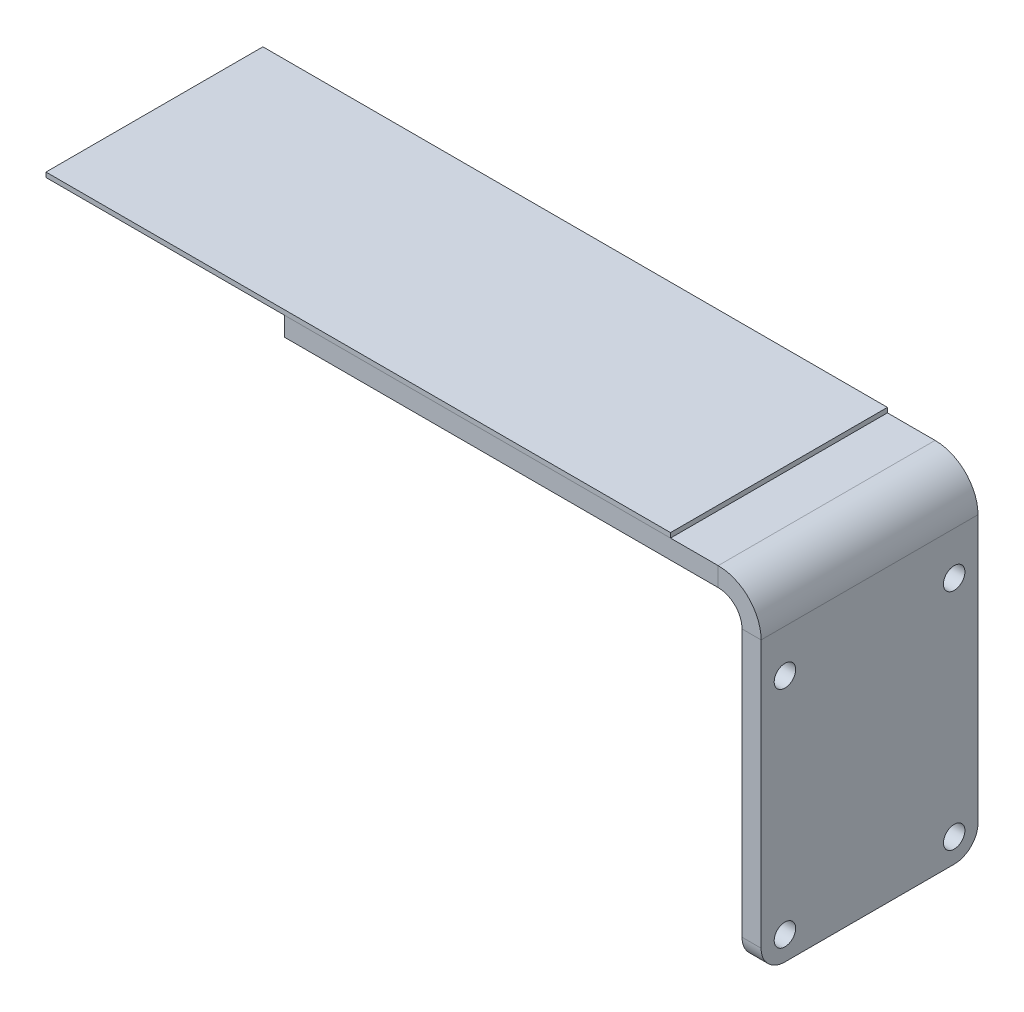
ISO-10303-21;
HEADER;
FILE_DESCRIPTION(('STEP AP214'),'2;1');
FILE_NAME('part.step','',(''),(''),'','','');
FILE_SCHEMA(('AUTOMOTIVE_DESIGN { 1 0 10303 214 1 1 1 1 }'));
ENDSEC;
DATA;
#1=APPLICATION_CONTEXT('core data for automotive mechanical design processes');
#2=APPLICATION_PROTOCOL_DEFINITION('international standard','automotive_design',2000,#1);
#3=PRODUCT_CONTEXT('',#1,'mechanical');
#4=PRODUCT('Part','Part','',(#3));
#5=PRODUCT_RELATED_PRODUCT_CATEGORY('part','',(#4));
#6=PRODUCT_DEFINITION_FORMATION('','',#4);
#7=PRODUCT_DEFINITION_CONTEXT('part definition',#1,'design');
#8=PRODUCT_DEFINITION('design','',#6,#7);
#9=PRODUCT_DEFINITION_SHAPE('','',#8);
#10=(LENGTH_UNIT() NAMED_UNIT(*) SI_UNIT(.MILLI.,.METRE.));
#11=(NAMED_UNIT(*) PLANE_ANGLE_UNIT() SI_UNIT($,.RADIAN.));
#12=(NAMED_UNIT(*) SI_UNIT($,.STERADIAN.) SOLID_ANGLE_UNIT());
#13=UNCERTAINTY_MEASURE_WITH_UNIT(LENGTH_MEASURE(1.E-05),#10,'distance_accuracy_value','');
#14=(GEOMETRIC_REPRESENTATION_CONTEXT(3) GLOBAL_UNCERTAINTY_ASSIGNED_CONTEXT((#13)) GLOBAL_UNIT_ASSIGNED_CONTEXT((#10,
#11,#12)) REPRESENTATION_CONTEXT('',''));
#15=CARTESIAN_POINT('',(0.,0.,0.));
#16=DIRECTION('',(0.,0.,1.));
#17=DIRECTION('',(1.,0.,0.));
#18=AXIS2_PLACEMENT_3D('',#15,#16,#17);
#19=CARTESIAN_POINT('',(-19.,36.,-22.75));
#20=DIRECTION('',(-1.,0.,0.));
#21=DIRECTION('',(0.,-1.,0.));
#22=AXIS2_PLACEMENT_3D('',#19,#20,#21);
#23=PLANE('',#22);
#24=DIRECTION('',(0.,0.,-1.));
#25=VECTOR('',#24,1.);
#26=CARTESIAN_POINT('',(-19.,35.,-22.75));
#27=LINE('',#26,#25);
#28=CARTESIAN_POINT('',(-19.,35.,22.75));
#29=VERTEX_POINT('',#28);
#30=CARTESIAN_POINT('',(-19.,35.,-22.75));
#31=VERTEX_POINT('',#30);
#32=EDGE_CURVE('E133',#29,#31,#27,.T.);
#33=ORIENTED_EDGE('',*,*,#32,.T.);
#34=DIRECTION('',(0.,-1.,0.));
#35=VECTOR('',#34,1.);
#36=CARTESIAN_POINT('',(-19.,36.,-22.75));
#37=LINE('',#36,#35);
#38=CARTESIAN_POINT('',(-19.,36.,-22.75));
#39=VERTEX_POINT('',#38);
#40=EDGE_CURVE('E14',#39,#31,#37,.T.);
#41=ORIENTED_EDGE('',*,*,#40,.F.);
#42=DIRECTION('',(0.,0.,-1.));
#43=VECTOR('',#42,1.);
#44=CARTESIAN_POINT('',(-19.,36.,-22.75));
#45=LINE('',#44,#43);
#46=CARTESIAN_POINT('',(-19.,36.,22.75));
#47=VERTEX_POINT('',#46);
#48=EDGE_CURVE('E121',#47,#39,#45,.T.);
#49=ORIENTED_EDGE('',*,*,#48,.F.);
#50=DIRECTION('',(0.,-1.,0.));
#51=VECTOR('',#50,1.);
#52=CARTESIAN_POINT('',(-19.,36.,22.75));
#53=LINE('',#52,#51);
#54=EDGE_CURVE('E129',#47,#29,#53,.T.);
#55=ORIENTED_EDGE('',*,*,#54,.T.);
#56=EDGE_LOOP('',(#33,#41,#49,#55));
#57=FACE_BOUND('',#56,.T.);
#58=ADVANCED_FACE('F70',(#57),#23,.F.);
#59=CARTESIAN_POINT('',(-19.,36.,-22.75));
#60=DIRECTION('',(0.,0.,1.));
#61=DIRECTION('',(1.,0.,0.));
#62=AXIS2_PLACEMENT_3D('',#59,#60,#61);
#63=PLANE('',#62);
#64=DIRECTION('',(-1.,0.,0.));
#65=VECTOR('',#64,1.);
#66=CARTESIAN_POINT('',(-19.,35.,-22.75));
#67=LINE('',#66,#65);
#68=CARTESIAN_POINT('',(-150.,35.0000000000005,-22.75));
#69=VERTEX_POINT('',#68);
#70=EDGE_CURVE('E125',#31,#69,#67,.T.);
#71=ORIENTED_EDGE('',*,*,#70,.T.);
#72=DIRECTION('',(0.,-1.,0.));
#73=VECTOR('',#72,1.);
#74=CARTESIAN_POINT('',(-150.,36.0000000000005,-22.75));
#75=LINE('',#74,#73);
#76=CARTESIAN_POINT('',(-150.,36.0000000000005,-22.75));
#77=VERTEX_POINT('',#76);
#78=EDGE_CURVE('E78',#77,#69,#75,.T.);
#79=ORIENTED_EDGE('',*,*,#78,.F.);
#80=DIRECTION('',(-1.,0.,0.));
#81=VECTOR('',#80,1.);
#82=CARTESIAN_POINT('',(-19.,36.,-22.75));
#83=LINE('',#82,#81);
#84=EDGE_CURVE('E116',#39,#77,#83,.T.);
#85=ORIENTED_EDGE('',*,*,#84,.F.);
#86=ORIENTED_EDGE('',*,*,#40,.T.);
#87=EDGE_LOOP('',(#71,#79,#85,#86));
#88=FACE_BOUND('',#87,.T.);
#89=ADVANCED_FACE('F124',(#88),#63,.F.);
#90=CARTESIAN_POINT('',(-150.,36.0000000000005,-22.75));
#91=DIRECTION('',(1.,0.,0.));
#92=DIRECTION('',(0.,1.,0.));
#93=AXIS2_PLACEMENT_3D('',#90,#91,#92);
#94=PLANE('',#93);
#95=DIRECTION('',(0.,0.,1.));
#96=VECTOR('',#95,1.);
#97=CARTESIAN_POINT('',(-150.,35.0000000000005,-22.75));
#98=LINE('',#97,#96);
#99=CARTESIAN_POINT('',(-150.,35.0000000000005,22.75));
#100=VERTEX_POINT('',#99);
#101=EDGE_CURVE('E103',#69,#100,#98,.T.);
#102=ORIENTED_EDGE('',*,*,#101,.T.);
#103=DIRECTION('',(0.,-1.,0.));
#104=VECTOR('',#103,1.);
#105=CARTESIAN_POINT('',(-150.,36.0000000000005,22.75));
#106=LINE('',#105,#104);
#107=CARTESIAN_POINT('',(-150.,36.0000000000005,22.75));
#108=VERTEX_POINT('',#107);
#109=EDGE_CURVE('E126',#108,#100,#106,.T.);
#110=ORIENTED_EDGE('',*,*,#109,.F.);
#111=DIRECTION('',(0.,0.,1.));
#112=VECTOR('',#111,1.);
#113=CARTESIAN_POINT('',(-150.,36.0000000000005,-22.75));
#114=LINE('',#113,#112);
#115=EDGE_CURVE('E119',#77,#108,#114,.T.);
#116=ORIENTED_EDGE('',*,*,#115,.F.);
#117=ORIENTED_EDGE('',*,*,#78,.T.);
#118=EDGE_LOOP('',(#102,#110,#116,#117));
#119=FACE_BOUND('',#118,.T.);
#120=ADVANCED_FACE('F127',(#119),#94,.F.);
#121=CARTESIAN_POINT('',(-19.,36.,22.75));
#122=DIRECTION('',(0.,0.,-1.));
#123=DIRECTION('',(-1.,0.,0.));
#124=AXIS2_PLACEMENT_3D('',#121,#122,#123);
#125=PLANE('',#124);
#126=DIRECTION('',(1.,0.,0.));
#127=VECTOR('',#126,1.);
#128=CARTESIAN_POINT('',(-19.,35.,22.75));
#129=LINE('',#128,#127);
#130=EDGE_CURVE('E109',#100,#29,#129,.T.);
#131=ORIENTED_EDGE('',*,*,#130,.T.);
#132=ORIENTED_EDGE('',*,*,#54,.F.);
#133=DIRECTION('',(1.,0.,0.));
#134=VECTOR('',#133,1.);
#135=CARTESIAN_POINT('',(-19.,36.,22.75));
#136=LINE('',#135,#134);
#137=EDGE_CURVE('E86',#108,#47,#136,.T.);
#138=ORIENTED_EDGE('',*,*,#137,.F.);
#139=ORIENTED_EDGE('',*,*,#109,.T.);
#140=EDGE_LOOP('',(#131,#132,#138,#139));
#141=FACE_BOUND('',#140,.T.);
#142=ADVANCED_FACE('F140',(#141),#125,.F.);
#143=CARTESIAN_POINT('',(1.23973138794617E-13,36.,0.));
#144=DIRECTION('',(0.,-1.,0.));
#145=DIRECTION('',(1.,0.,0.));
#146=AXIS2_PLACEMENT_3D('',#143,#144,#145);
#147=PLANE('',#146);
#148=ORIENTED_EDGE('',*,*,#48,.T.);
#149=ORIENTED_EDGE('',*,*,#84,.T.);
#150=ORIENTED_EDGE('',*,*,#115,.T.);
#151=ORIENTED_EDGE('',*,*,#137,.T.);
#152=EDGE_LOOP('',(#148,#149,#150,#151));
#153=FACE_BOUND('',#152,.T.);
#154=ADVANCED_FACE('F117',(#153),#147,.F.);
#155=CARTESIAN_POINT('',(1.20503691842664E-13,35.,0.));
#156=DIRECTION('',(0.,-1.,0.));
#157=DIRECTION('',(1.,0.,0.));
#158=AXIS2_PLACEMENT_3D('',#155,#156,#157);
#159=PLANE('',#158);
#160=ORIENTED_EDGE('',*,*,#32,.F.);
#161=ORIENTED_EDGE('',*,*,#130,.F.);
#162=ORIENTED_EDGE('',*,*,#101,.F.);
#163=ORIENTED_EDGE('',*,*,#70,.F.);
#164=EDGE_LOOP('',(#160,#161,#162,#163));
#165=FACE_BOUND('',#164,.T.);
#166=ADVANCED_FACE('F143',(#165),#159,.T.);
#167=CLOSED_SHELL('',(#58,#89,#120,#142,#154,#166));
#168=MANIFOLD_SOLID_BREP('B2',#167);
#169=CARTESIAN_POINT('',(-4.,-35.,-22.75));
#170=DIRECTION('',(0.,0.,-1.));
#171=DIRECTION('',(-1.,0.,0.));
#172=AXIS2_PLACEMENT_3D('',#169,#170,#171);
#173=PLANE('',#172);
#174=DIRECTION('',(0.,1.,0.));
#175=VECTOR('',#174,1.);
#176=CARTESIAN_POINT('',(0.,-35.,-22.75));
#177=LINE('',#176,#175);
#178=CARTESIAN_POINT('',(0.,-30.,-22.75));
#179=VERTEX_POINT('',#178);
#180=CARTESIAN_POINT('',(0.,26.,-22.75));
#181=VERTEX_POINT('',#180);
#182=EDGE_CURVE('E377',#179,#181,#177,.T.);
#183=ORIENTED_EDGE('',*,*,#182,.F.);
#184=DIRECTION('',(1.,0.,0.));
#185=VECTOR('',#184,1.);
#186=CARTESIAN_POINT('',(-4.,-30.,-22.75));
#187=LINE('',#186,#185);
#188=CARTESIAN_POINT('',(-4.,-30.,-22.75));
#189=VERTEX_POINT('',#188);
#190=EDGE_CURVE('E228',#179,#189,#187,.F.);
#191=ORIENTED_EDGE('',*,*,#190,.T.);
#192=DIRECTION('',(0.,1.,0.));
#193=VECTOR('',#192,1.);
#194=CARTESIAN_POINT('',(-4.,-35.,-22.75));
#195=LINE('',#194,#193);
#196=CARTESIAN_POINT('',(-4.,26.,-22.75));
#197=VERTEX_POINT('',#196);
#198=EDGE_CURVE('E380',#189,#197,#195,.T.);
#199=ORIENTED_EDGE('',*,*,#198,.T.);
#200=DIRECTION('',(1.,0.,0.));
#201=VECTOR('',#200,1.);
#202=CARTESIAN_POINT('',(-4.,26.,-22.75));
#203=LINE('',#202,#201);
#204=EDGE_CURVE('E342',#197,#181,#203,.T.);
#205=ORIENTED_EDGE('',*,*,#204,.T.);
#206=EDGE_LOOP('',(#183,#191,#199,#205));
#207=FACE_BOUND('',#206,.T.);
#208=ADVANCED_FACE('F205',(#207),#173,.T.);
#209=CARTESIAN_POINT('',(-4.,0.,0.));
#210=DIRECTION('',(-1.,0.,0.));
#211=DIRECTION('',(0.,0.,1.));
#212=AXIS2_PLACEMENT_3D('',#209,#210,#211);
#213=PLANE('',#212);
#214=CARTESIAN_POINT('',(-4.,17.,17.75));
#215=DIRECTION('',(1.,0.,0.));
#216=DIRECTION('',(0.,0.,-1.));
#217=AXIS2_PLACEMENT_3D('',#214,#215,#216);
#218=CIRCLE('',#217,2.25);
#219=CARTESIAN_POINT('',(-4.,17.,15.5));
#220=VERTEX_POINT('',#219);
#221=EDGE_CURVE('E356',#220,#220,#218,.T.);
#222=ORIENTED_EDGE('',*,*,#221,.T.);
#223=EDGE_LOOP('',(#222));
#224=FACE_BOUND('',#223,.T.);
#225=CARTESIAN_POINT('',(-4.,17.,-17.75));
#226=DIRECTION('',(1.,0.,0.));
#227=DIRECTION('',(0.,0.,-1.));
#228=AXIS2_PLACEMENT_3D('',#225,#226,#227);
#229=CIRCLE('',#228,2.25);
#230=CARTESIAN_POINT('',(-4.,17.,-20.));
#231=VERTEX_POINT('',#230);
#232=EDGE_CURVE('E362',#231,#231,#229,.T.);
#233=ORIENTED_EDGE('',*,*,#232,.T.);
#234=EDGE_LOOP('',(#233));
#235=FACE_BOUND('',#234,.T.);
#236=CARTESIAN_POINT('',(-4.,-30.,-17.75));
#237=DIRECTION('',(1.,0.,0.));
#238=DIRECTION('',(0.,0.,-1.));
#239=AXIS2_PLACEMENT_3D('',#236,#237,#238);
#240=CIRCLE('',#239,2.25);
#241=CARTESIAN_POINT('',(-4.,-30.,-20.));
#242=VERTEX_POINT('',#241);
#243=EDGE_CURVE('E368',#242,#242,#240,.T.);
#244=ORIENTED_EDGE('',*,*,#243,.T.);
#245=EDGE_LOOP('',(#244));
#246=FACE_BOUND('',#245,.T.);
#247=CARTESIAN_POINT('',(-4.,-30.,17.75));
#248=DIRECTION('',(1.,0.,0.));
#249=DIRECTION('',(0.,0.,-1.));
#250=AXIS2_PLACEMENT_3D('',#247,#248,#249);
#251=CIRCLE('',#250,2.25);
#252=CARTESIAN_POINT('',(-4.,-30.,15.5));
#253=VERTEX_POINT('',#252);
#254=EDGE_CURVE('E374',#253,#253,#251,.T.);
#255=ORIENTED_EDGE('',*,*,#254,.T.);
#256=EDGE_LOOP('',(#255));
#257=FACE_BOUND('',#256,.T.);
#258=ORIENTED_EDGE('',*,*,#198,.F.);
#259=CARTESIAN_POINT('',(-4.,-30.,-17.75));
#260=DIRECTION('',(-1.,0.,0.));
#261=DIRECTION('',(0.,0.,1.));
#262=AXIS2_PLACEMENT_3D('',#259,#260,#261);
#263=CIRCLE('',#262,5.);
#264=CARTESIAN_POINT('',(-4.,-35.,-17.75));
#265=VERTEX_POINT('',#264);
#266=EDGE_CURVE('E213',#189,#265,#263,.T.);
#267=ORIENTED_EDGE('',*,*,#266,.T.);
#268=DIRECTION('',(0.,0.,-1.));
#269=VECTOR('',#268,1.);
#270=CARTESIAN_POINT('',(-4.,-35.,22.75));
#271=LINE('',#270,#269);
#272=CARTESIAN_POINT('',(-4.,-35.,17.75));
#273=VERTEX_POINT('',#272);
#274=EDGE_CURVE('E385',#273,#265,#271,.T.);
#275=ORIENTED_EDGE('',*,*,#274,.F.);
#276=CARTESIAN_POINT('',(-4.,-30.,17.75));
#277=DIRECTION('',(-1.,0.,0.));
#278=DIRECTION('',(0.,0.,1.));
#279=AXIS2_PLACEMENT_3D('',#276,#277,#278);
#280=CIRCLE('',#279,5.);
#281=CARTESIAN_POINT('',(-4.,-30.,22.75));
#282=VERTEX_POINT('',#281);
#283=EDGE_CURVE('E220',#273,#282,#280,.T.);
#284=ORIENTED_EDGE('',*,*,#283,.T.);
#285=DIRECTION('',(0.,-1.,0.));
#286=VECTOR('',#285,1.);
#287=CARTESIAN_POINT('',(-4.,-35.,22.75));
#288=LINE('',#287,#286);
#289=CARTESIAN_POINT('',(-4.,26.,22.75));
#290=VERTEX_POINT('',#289);
#291=EDGE_CURVE('E382',#290,#282,#288,.T.);
#292=ORIENTED_EDGE('',*,*,#291,.F.);
#293=DIRECTION('',(0.,0.,-1.));
#294=VECTOR('',#293,1.);
#295=CARTESIAN_POINT('',(-4.,26.,-22.75));
#296=LINE('',#295,#294);
#297=EDGE_CURVE('E346',#197,#290,#296,.F.);
#298=ORIENTED_EDGE('',*,*,#297,.F.);
#299=EDGE_LOOP('',(#258,#267,#275,#284,#292,#298));
#300=FACE_BOUND('',#299,.T.);
#301=ADVANCED_FACE('F405',(#224,#235,#246,#257,#300),#213,.T.);
#302=CARTESIAN_POINT('',(0.,0.,0.));
#303=DIRECTION('',(-1.,0.,0.));
#304=DIRECTION('',(0.,0.,1.));
#305=AXIS2_PLACEMENT_3D('',#302,#303,#304);
#306=PLANE('',#305);
#307=CARTESIAN_POINT('',(0.,-30.,17.75));
#308=DIRECTION('',(1.,0.,0.));
#309=DIRECTION('',(0.,0.,-1.));
#310=AXIS2_PLACEMENT_3D('',#307,#308,#309);
#311=CIRCLE('',#310,2.25);
#312=CARTESIAN_POINT('',(0.,-30.,15.5));
#313=VERTEX_POINT('',#312);
#314=EDGE_CURVE('E371',#313,#313,#311,.T.);
#315=ORIENTED_EDGE('',*,*,#314,.F.);
#316=EDGE_LOOP('',(#315));
#317=FACE_BOUND('',#316,.T.);
#318=CARTESIAN_POINT('',(0.,-30.,-17.75));
#319=DIRECTION('',(1.,0.,0.));
#320=DIRECTION('',(0.,0.,-1.));
#321=AXIS2_PLACEMENT_3D('',#318,#319,#320);
#322=CIRCLE('',#321,2.25);
#323=CARTESIAN_POINT('',(0.,-30.,-20.));
#324=VERTEX_POINT('',#323);
#325=EDGE_CURVE('E365',#324,#324,#322,.T.);
#326=ORIENTED_EDGE('',*,*,#325,.F.);
#327=EDGE_LOOP('',(#326));
#328=FACE_BOUND('',#327,.T.);
#329=CARTESIAN_POINT('',(0.,17.,-17.75));
#330=DIRECTION('',(1.,0.,0.));
#331=DIRECTION('',(0.,0.,-1.));
#332=AXIS2_PLACEMENT_3D('',#329,#330,#331);
#333=CIRCLE('',#332,2.25);
#334=CARTESIAN_POINT('',(0.,17.,-20.));
#335=VERTEX_POINT('',#334);
#336=EDGE_CURVE('E359',#335,#335,#333,.T.);
#337=ORIENTED_EDGE('',*,*,#336,.F.);
#338=EDGE_LOOP('',(#337));
#339=FACE_BOUND('',#338,.T.);
#340=CARTESIAN_POINT('',(0.,17.,17.75));
#341=DIRECTION('',(1.,0.,0.));
#342=DIRECTION('',(0.,0.,-1.));
#343=AXIS2_PLACEMENT_3D('',#340,#341,#342);
#344=CIRCLE('',#343,2.25);
#345=CARTESIAN_POINT('',(0.,17.,15.5));
#346=VERTEX_POINT('',#345);
#347=EDGE_CURVE('E353',#346,#346,#344,.T.);
#348=ORIENTED_EDGE('',*,*,#347,.F.);
#349=EDGE_LOOP('',(#348));
#350=FACE_BOUND('',#349,.T.);
#351=DIRECTION('',(0.,0.,-1.));
#352=VECTOR('',#351,1.);
#353=CARTESIAN_POINT('',(0.,-35.,22.75));
#354=LINE('',#353,#352);
#355=CARTESIAN_POINT('',(0.,-35.,17.75));
#356=VERTEX_POINT('',#355);
#357=CARTESIAN_POINT('',(0.,-35.,-17.75));
#358=VERTEX_POINT('',#357);
#359=EDGE_CURVE('E383',#356,#358,#354,.T.);
#360=ORIENTED_EDGE('',*,*,#359,.T.);
#361=CARTESIAN_POINT('',(0.,-30.,-17.75));
#362=DIRECTION('',(-1.,0.,0.));
#363=DIRECTION('',(0.,0.,1.));
#364=AXIS2_PLACEMENT_3D('',#361,#362,#363);
#365=CIRCLE('',#364,5.);
#366=EDGE_CURVE('E401',#358,#179,#365,.F.);
#367=ORIENTED_EDGE('',*,*,#366,.T.);
#368=ORIENTED_EDGE('',*,*,#182,.T.);
#369=DIRECTION('',(0.,0.,-1.));
#370=VECTOR('',#369,1.);
#371=CARTESIAN_POINT('',(0.,26.,-22.75));
#372=LINE('',#371,#370);
#373=CARTESIAN_POINT('',(0.,26.,22.75));
#374=VERTEX_POINT('',#373);
#375=EDGE_CURVE('E292',#181,#374,#372,.F.);
#376=ORIENTED_EDGE('',*,*,#375,.T.);
#377=DIRECTION('',(0.,-1.,0.));
#378=VECTOR('',#377,1.);
#379=CARTESIAN_POINT('',(0.,-35.,22.75));
#380=LINE('',#379,#378);
#381=CARTESIAN_POINT('',(0.,-30.,22.75));
#382=VERTEX_POINT('',#381);
#383=EDGE_CURVE('E390',#374,#382,#380,.T.);
#384=ORIENTED_EDGE('',*,*,#383,.T.);
#385=CARTESIAN_POINT('',(0.,-30.,17.75));
#386=DIRECTION('',(-1.,0.,0.));
#387=DIRECTION('',(0.,0.,1.));
#388=AXIS2_PLACEMENT_3D('',#385,#386,#387);
#389=CIRCLE('',#388,5.);
#390=EDGE_CURVE('E399',#382,#356,#389,.F.);
#391=ORIENTED_EDGE('',*,*,#390,.T.);
#392=EDGE_LOOP('',(#360,#367,#368,#376,#384,#391));
#393=FACE_BOUND('',#392,.T.);
#394=ADVANCED_FACE('F415',(#317,#328,#339,#350,#393),#306,.F.);
#395=CARTESIAN_POINT('',(-4.,-35.,22.75));
#396=DIRECTION('',(0.,-1.,0.));
#397=DIRECTION('',(0.,0.,-1.));
#398=AXIS2_PLACEMENT_3D('',#395,#396,#397);
#399=PLANE('',#398);
#400=ORIENTED_EDGE('',*,*,#274,.T.);
#401=DIRECTION('',(1.,0.,0.));
#402=VECTOR('',#401,1.);
#403=CARTESIAN_POINT('',(-4.,-35.,-17.75));
#404=LINE('',#403,#402);
#405=EDGE_CURVE('E396',#265,#358,#404,.T.);
#406=ORIENTED_EDGE('',*,*,#405,.T.);
#407=ORIENTED_EDGE('',*,*,#359,.F.);
#408=DIRECTION('',(1.,0.,0.));
#409=VECTOR('',#408,1.);
#410=CARTESIAN_POINT('',(-4.,-35.,17.75));
#411=LINE('',#410,#409);
#412=EDGE_CURVE('E388',#356,#273,#411,.F.);
#413=ORIENTED_EDGE('',*,*,#412,.T.);
#414=EDGE_LOOP('',(#400,#406,#407,#413));
#415=FACE_BOUND('',#414,.T.);
#416=ADVANCED_FACE('F410',(#415),#399,.T.);
#417=CARTESIAN_POINT('',(-4.,-35.,22.75));
#418=DIRECTION('',(0.,0.,1.));
#419=DIRECTION('',(1.,0.,0.));
#420=AXIS2_PLACEMENT_3D('',#417,#418,#419);
#421=PLANE('',#420);
#422=ORIENTED_EDGE('',*,*,#291,.T.);
#423=DIRECTION('',(1.,0.,0.));
#424=VECTOR('',#423,1.);
#425=CARTESIAN_POINT('',(-4.,-30.,22.75));
#426=LINE('',#425,#424);
#427=EDGE_CURVE('E68',#282,#382,#426,.T.);
#428=ORIENTED_EDGE('',*,*,#427,.T.);
#429=ORIENTED_EDGE('',*,*,#383,.F.);
#430=DIRECTION('',(1.,0.,0.));
#431=VECTOR('',#430,1.);
#432=CARTESIAN_POINT('',(-4.,26.,22.75));
#433=LINE('',#432,#431);
#434=EDGE_CURVE('E350',#290,#374,#433,.T.);
#435=ORIENTED_EDGE('',*,*,#434,.F.);
#436=EDGE_LOOP('',(#422,#428,#429,#435));
#437=FACE_BOUND('',#436,.T.);
#438=ADVANCED_FACE('F446',(#437),#421,.T.);
#439=CARTESIAN_POINT('',(-4.,-30.,17.75));
#440=DIRECTION('',(1.,0.,0.));
#441=DIRECTION('',(0.,0.,-1.));
#442=AXIS2_PLACEMENT_3D('',#439,#440,#441);
#443=CYLINDRICAL_SURFACE('',#442,2.25);
#444=ORIENTED_EDGE('',*,*,#254,.F.);
#445=EDGE_LOOP('',(#444));
#446=FACE_BOUND('',#445,.T.);
#447=ORIENTED_EDGE('',*,*,#314,.T.);
#448=EDGE_LOOP('',(#447));
#449=FACE_BOUND('',#448,.T.);
#450=ADVANCED_FACE('F449',(#446,#449),#443,.F.);
#451=CARTESIAN_POINT('',(-4.,-30.,-17.75));
#452=DIRECTION('',(1.,0.,0.));
#453=DIRECTION('',(0.,0.,-1.));
#454=AXIS2_PLACEMENT_3D('',#451,#452,#453);
#455=CYLINDRICAL_SURFACE('',#454,2.25);
#456=ORIENTED_EDGE('',*,*,#243,.F.);
#457=EDGE_LOOP('',(#456));
#458=FACE_BOUND('',#457,.T.);
#459=ORIENTED_EDGE('',*,*,#325,.T.);
#460=EDGE_LOOP('',(#459));
#461=FACE_BOUND('',#460,.T.);
#462=ADVANCED_FACE('F458',(#458,#461),#455,.F.);
#463=CARTESIAN_POINT('',(-4.,17.,-17.75));
#464=DIRECTION('',(1.,0.,0.));
#465=DIRECTION('',(0.,0.,-1.));
#466=AXIS2_PLACEMENT_3D('',#463,#464,#465);
#467=CYLINDRICAL_SURFACE('',#466,2.25);
#468=ORIENTED_EDGE('',*,*,#232,.F.);
#469=EDGE_LOOP('',(#468));
#470=FACE_BOUND('',#469,.T.);
#471=ORIENTED_EDGE('',*,*,#336,.T.);
#472=EDGE_LOOP('',(#471));
#473=FACE_BOUND('',#472,.T.);
#474=ADVANCED_FACE('F462',(#470,#473),#467,.F.);
#475=CARTESIAN_POINT('',(-4.,17.,17.75));
#476=DIRECTION('',(1.,0.,0.));
#477=DIRECTION('',(0.,0.,-1.));
#478=AXIS2_PLACEMENT_3D('',#475,#476,#477);
#479=CYLINDRICAL_SURFACE('',#478,2.25);
#480=ORIENTED_EDGE('',*,*,#221,.F.);
#481=EDGE_LOOP('',(#480));
#482=FACE_BOUND('',#481,.T.);
#483=ORIENTED_EDGE('',*,*,#347,.T.);
#484=EDGE_LOOP('',(#483));
#485=FACE_BOUND('',#484,.T.);
#486=ADVANCED_FACE('F466',(#482,#485),#479,.F.);
#487=CARTESIAN_POINT('',(-9.,26.,22.75));
#488=DIRECTION('',(0.,0.,1.));
#489=DIRECTION('',(1.,0.,0.));
#490=AXIS2_PLACEMENT_3D('',#487,#488,#489);
#491=PLANE('',#490);
#492=DIRECTION('',(0.,1.,0.));
#493=VECTOR('',#492,1.);
#494=CARTESIAN_POINT('',(-8.99999999999997,35.,22.75));
#495=LINE('',#494,#493);
#496=CARTESIAN_POINT('',(-8.99999999999998,31.,22.75));
#497=VERTEX_POINT('',#496);
#498=CARTESIAN_POINT('',(-8.99999999999997,35.,22.75));
#499=VERTEX_POINT('',#498);
#500=EDGE_CURVE('E337',#497,#499,#495,.T.);
#501=ORIENTED_EDGE('',*,*,#500,.F.);
#502=CARTESIAN_POINT('',(-9.,26.,22.75));
#503=DIRECTION('',(0.,0.,-1.));
#504=DIRECTION('',(-1.,0.,0.));
#505=AXIS2_PLACEMENT_3D('',#502,#503,#504);
#506=CIRCLE('',#505,5.);
#507=EDGE_CURVE('E295',#290,#497,#506,.F.);
#508=ORIENTED_EDGE('',*,*,#507,.F.);
#509=ORIENTED_EDGE('',*,*,#434,.T.);
#510=CARTESIAN_POINT('',(-9.,26.,22.75));
#511=DIRECTION('',(0.,0.,-1.));
#512=DIRECTION('',(-1.,0.,0.));
#513=AXIS2_PLACEMENT_3D('',#510,#511,#512);
#514=CIRCLE('',#513,9.);
#515=EDGE_CURVE('E341',#374,#499,#514,.F.);
#516=ORIENTED_EDGE('',*,*,#515,.T.);
#517=EDGE_LOOP('',(#501,#508,#509,#516));
#518=FACE_BOUND('',#517,.T.);
#519=ADVANCED_FACE('F470',(#518),#491,.T.);
#520=CARTESIAN_POINT('',(-9.,26.,-22.75));
#521=DIRECTION('',(0.,0.,1.));
#522=DIRECTION('',(1.,0.,0.));
#523=AXIS2_PLACEMENT_3D('',#520,#521,#522);
#524=PLANE('',#523);
#525=CARTESIAN_POINT('',(-9.,26.,-22.75));
#526=DIRECTION('',(0.,0.,-1.));
#527=DIRECTION('',(-1.,0.,0.));
#528=AXIS2_PLACEMENT_3D('',#525,#526,#527);
#529=CIRCLE('',#528,5.);
#530=CARTESIAN_POINT('',(-8.99999999999998,31.,-22.75));
#531=VERTEX_POINT('',#530);
#532=EDGE_CURVE('E302',#531,#197,#529,.T.);
#533=ORIENTED_EDGE('',*,*,#532,.F.);
#534=DIRECTION('',(0.,1.,0.));
#535=VECTOR('',#534,1.);
#536=CARTESIAN_POINT('',(-8.99999999999998,31.,-22.75));
#537=LINE('',#536,#535);
#538=CARTESIAN_POINT('',(-8.99999999999997,35.,-22.75));
#539=VERTEX_POINT('',#538);
#540=EDGE_CURVE('E299',#531,#539,#537,.T.);
#541=ORIENTED_EDGE('',*,*,#540,.T.);
#542=CARTESIAN_POINT('',(-9.,26.,-22.75));
#543=DIRECTION('',(0.,0.,-1.));
#544=DIRECTION('',(-1.,0.,0.));
#545=AXIS2_PLACEMENT_3D('',#542,#543,#544);
#546=CIRCLE('',#545,9.);
#547=EDGE_CURVE('E285',#539,#181,#546,.T.);
#548=ORIENTED_EDGE('',*,*,#547,.T.);
#549=ORIENTED_EDGE('',*,*,#204,.F.);
#550=EDGE_LOOP('',(#533,#541,#548,#549));
#551=FACE_BOUND('',#550,.T.);
#552=ADVANCED_FACE('F300',(#551),#524,.F.);
#553=CARTESIAN_POINT('',(-9.,26.,-22.75));
#554=DIRECTION('',(0.,0.,-1.));
#555=DIRECTION('',(0.,1.,0.));
#556=AXIS2_PLACEMENT_3D('',#553,#554,#555);
#557=CYLINDRICAL_SURFACE('',#556,9.);
#558=ORIENTED_EDGE('',*,*,#375,.F.);
#559=ORIENTED_EDGE('',*,*,#547,.F.);
#560=DIRECTION('',(0.,0.,-1.));
#561=VECTOR('',#560,1.);
#562=CARTESIAN_POINT('',(-8.99999999999997,35.,0.));
#563=LINE('',#562,#561);
#564=EDGE_CURVE('E290',#499,#539,#563,.T.);
#565=ORIENTED_EDGE('',*,*,#564,.F.);
#566=ORIENTED_EDGE('',*,*,#515,.F.);
#567=EDGE_LOOP('',(#558,#559,#565,#566));
#568=FACE_BOUND('',#567,.T.);
#569=ADVANCED_FACE('F287',(#568),#557,.T.);
#570=CARTESIAN_POINT('',(-9.,26.,-22.75));
#571=DIRECTION('',(0.,0.,-1.));
#572=DIRECTION('',(0.,1.,0.));
#573=AXIS2_PLACEMENT_3D('',#570,#571,#572);
#574=CYLINDRICAL_SURFACE('',#573,5.);
#575=ORIENTED_EDGE('',*,*,#297,.T.);
#576=ORIENTED_EDGE('',*,*,#507,.T.);
#577=DIRECTION('',(0.,0.,1.));
#578=VECTOR('',#577,1.);
#579=CARTESIAN_POINT('',(-8.99999999999998,31.,22.75));
#580=LINE('',#579,#578);
#581=EDGE_CURVE('E307',#497,#531,#580,.F.);
#582=ORIENTED_EDGE('',*,*,#581,.T.);
#583=ORIENTED_EDGE('',*,*,#532,.T.);
#584=EDGE_LOOP('',(#575,#576,#582,#583));
#585=FACE_BOUND('',#584,.T.);
#586=ADVANCED_FACE('F417',(#585),#574,.F.);
#587=CARTESIAN_POINT('',(-3.99999999999999,35.,-22.75));
#588=DIRECTION('',(0.,0.,-1.));
#589=DIRECTION('',(-1.,0.,0.));
#590=AXIS2_PLACEMENT_3D('',#587,#588,#589);
#591=PLANE('',#590);
#592=DIRECTION('',(1.,0.,0.));
#593=VECTOR('',#592,1.);
#594=CARTESIAN_POINT('',(-3.99999999999999,35.,-22.75));
#595=LINE('',#594,#593);
#596=CARTESIAN_POINT('',(-100.,35.0000000000003,-22.75));
#597=VERTEX_POINT('',#596);
#598=EDGE_CURVE('E314',#597,#539,#595,.T.);
#599=ORIENTED_EDGE('',*,*,#598,.T.);
#600=ORIENTED_EDGE('',*,*,#540,.F.);
#601=DIRECTION('',(-1.,0.,0.));
#602=VECTOR('',#601,1.);
#603=CARTESIAN_POINT('',(1.21430643318376E-13,31.,-22.75));
#604=LINE('',#603,#602);
#605=CARTESIAN_POINT('',(-100.,31.0000000000003,-22.75));
#606=VERTEX_POINT('',#605);
#607=EDGE_CURVE('E330',#606,#531,#604,.F.);
#608=ORIENTED_EDGE('',*,*,#607,.F.);
#609=DIRECTION('',(0.,-1.,0.));
#610=VECTOR('',#609,1.);
#611=CARTESIAN_POINT('',(-100.,35.0000000000003,-22.75));
#612=LINE('',#611,#610);
#613=EDGE_CURVE('E319',#597,#606,#612,.T.);
#614=ORIENTED_EDGE('',*,*,#613,.F.);
#615=EDGE_LOOP('',(#599,#600,#608,#614));
#616=FACE_BOUND('',#615,.T.);
#617=ADVANCED_FACE('F318',(#616),#591,.T.);
#618=CARTESIAN_POINT('',(-100.,35.0000000000003,22.75));
#619=DIRECTION('',(0.,0.,1.));
#620=DIRECTION('',(1.,0.,0.));
#621=AXIS2_PLACEMENT_3D('',#618,#619,#620);
#622=PLANE('',#621);
#623=DIRECTION('',(1.,0.,0.));
#624=VECTOR('',#623,1.);
#625=CARTESIAN_POINT('',(1.21430643318376E-13,31.,22.75));
#626=LINE('',#625,#624);
#627=CARTESIAN_POINT('',(-100.,31.0000000000003,22.75));
#628=VERTEX_POINT('',#627);
#629=EDGE_CURVE('E316',#497,#628,#626,.F.);
#630=ORIENTED_EDGE('',*,*,#629,.F.);
#631=ORIENTED_EDGE('',*,*,#500,.T.);
#632=DIRECTION('',(-1.,0.,0.));
#633=VECTOR('',#632,1.);
#634=CARTESIAN_POINT('',(-100.,35.0000000000003,22.75));
#635=LINE('',#634,#633);
#636=CARTESIAN_POINT('',(-100.,35.0000000000003,22.75));
#637=VERTEX_POINT('',#636);
#638=EDGE_CURVE('E315',#499,#637,#635,.T.);
#639=ORIENTED_EDGE('',*,*,#638,.T.);
#640=DIRECTION('',(0.,-1.,0.));
#641=VECTOR('',#640,1.);
#642=CARTESIAN_POINT('',(-100.,35.0000000000003,22.75));
#643=LINE('',#642,#641);
#644=EDGE_CURVE('E321',#637,#628,#643,.T.);
#645=ORIENTED_EDGE('',*,*,#644,.T.);
#646=EDGE_LOOP('',(#630,#631,#639,#645));
#647=FACE_BOUND('',#646,.T.);
#648=ADVANCED_FACE('F424',(#647),#622,.T.);
#649=CARTESIAN_POINT('',(1.35396568673749E-13,35.,0.));
#650=DIRECTION('',(0.,1.,0.));
#651=DIRECTION('',(-1.,0.,0.));
#652=AXIS2_PLACEMENT_3D('',#649,#650,#651);
#653=PLANE('',#652);
#654=ORIENTED_EDGE('',*,*,#638,.F.);
#655=ORIENTED_EDGE('',*,*,#564,.T.);
#656=ORIENTED_EDGE('',*,*,#598,.F.);
#657=DIRECTION('',(0.,0.,-1.));
#658=VECTOR('',#657,1.);
#659=CARTESIAN_POINT('',(-100.,35.0000000000003,-22.75));
#660=LINE('',#659,#658);
#661=EDGE_CURVE('E322',#637,#597,#660,.T.);
#662=ORIENTED_EDGE('',*,*,#661,.F.);
#663=EDGE_LOOP('',(#654,#655,#656,#662));
#664=FACE_BOUND('',#663,.T.);
#665=ADVANCED_FACE('F312',(#664),#653,.T.);
#666=CARTESIAN_POINT('',(1.21430643318376E-13,31.,0.));
#667=DIRECTION('',(0.,1.,0.));
#668=DIRECTION('',(-1.,0.,0.));
#669=AXIS2_PLACEMENT_3D('',#666,#667,#668);
#670=PLANE('',#669);
#671=ORIENTED_EDGE('',*,*,#581,.F.);
#672=ORIENTED_EDGE('',*,*,#629,.T.);
#673=DIRECTION('',(0.,0.,1.));
#674=VECTOR('',#673,1.);
#675=CARTESIAN_POINT('',(-100.,31.0000000000003,0.));
#676=LINE('',#675,#674);
#677=EDGE_CURVE('E332',#628,#606,#676,.F.);
#678=ORIENTED_EDGE('',*,*,#677,.T.);
#679=ORIENTED_EDGE('',*,*,#607,.T.);
#680=EDGE_LOOP('',(#671,#672,#678,#679));
#681=FACE_BOUND('',#680,.T.);
#682=ADVANCED_FACE('F422',(#681),#670,.F.);
#683=CARTESIAN_POINT('',(-100.,35.0000000000003,-22.75));
#684=DIRECTION('',(-1.,0.,0.));
#685=DIRECTION('',(0.,-1.,0.));
#686=AXIS2_PLACEMENT_3D('',#683,#684,#685);
#687=PLANE('',#686);
#688=ORIENTED_EDGE('',*,*,#677,.F.);
#689=ORIENTED_EDGE('',*,*,#644,.F.);
#690=ORIENTED_EDGE('',*,*,#661,.T.);
#691=ORIENTED_EDGE('',*,*,#613,.T.);
#692=EDGE_LOOP('',(#688,#689,#690,#691));
#693=FACE_BOUND('',#692,.T.);
#694=ADVANCED_FACE('F428',(#693),#687,.T.);
#695=CARTESIAN_POINT('',(-4.,-30.,-17.75));
#696=DIRECTION('',(1.,0.,0.));
#697=DIRECTION('',(0.,0.,-1.));
#698=AXIS2_PLACEMENT_3D('',#695,#696,#697);
#699=CYLINDRICAL_SURFACE('',#698,5.);
#700=ORIENTED_EDGE('',*,*,#266,.F.);
#701=ORIENTED_EDGE('',*,*,#190,.F.);
#702=ORIENTED_EDGE('',*,*,#366,.F.);
#703=ORIENTED_EDGE('',*,*,#405,.F.);
#704=EDGE_LOOP('',(#700,#701,#702,#703));
#705=FACE_BOUND('',#704,.T.);
#706=ADVANCED_FACE('F413',(#705),#699,.T.);
#707=CARTESIAN_POINT('',(-4.,-30.,17.75));
#708=DIRECTION('',(1.,0.,0.));
#709=DIRECTION('',(0.,0.,-1.));
#710=AXIS2_PLACEMENT_3D('',#707,#708,#709);
#711=CYLINDRICAL_SURFACE('',#710,5.);
#712=ORIENTED_EDGE('',*,*,#283,.F.);
#713=ORIENTED_EDGE('',*,*,#412,.F.);
#714=ORIENTED_EDGE('',*,*,#390,.F.);
#715=ORIENTED_EDGE('',*,*,#427,.F.);
#716=EDGE_LOOP('',(#712,#713,#714,#715));
#717=FACE_BOUND('',#716,.T.);
#718=ADVANCED_FACE('F207',(#717),#711,.T.);
#719=CLOSED_SHELL('',(#208,#301,#394,#416,#438,#450,#462,#474,#486,#519,#552,#569,#586,#617,
#648,#665,#682,#694,#706,#718));
#720=MANIFOLD_SOLID_BREP('B8',#719);
#721=ADVANCED_BREP_SHAPE_REPRESENTATION('',(#18,#168,#720),#14);
#722=SHAPE_DEFINITION_REPRESENTATION(#9,#721);
ENDSEC;
END-ISO-10303-21;
